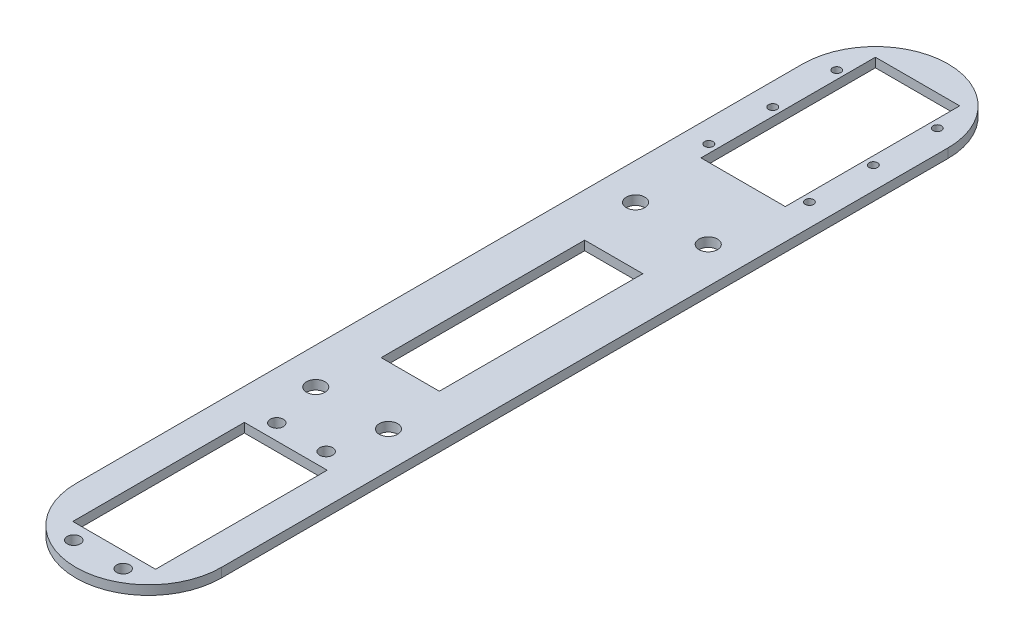
ISO-10303-21;
HEADER;
FILE_DESCRIPTION(('STEP AP214'),'2;1');
FILE_NAME('part.step','',(''),(''),'','','');
FILE_SCHEMA(('AUTOMOTIVE_DESIGN { 1 0 10303 214 1 1 1 1 }'));
ENDSEC;
DATA;
#1=APPLICATION_CONTEXT('core data for automotive mechanical design processes');
#2=APPLICATION_PROTOCOL_DEFINITION('international standard','automotive_design',2000,#1);
#3=PRODUCT_CONTEXT('',#1,'mechanical');
#4=PRODUCT('Part','Part','',(#3));
#5=PRODUCT_RELATED_PRODUCT_CATEGORY('part','',(#4));
#6=PRODUCT_DEFINITION_FORMATION('','',#4);
#7=PRODUCT_DEFINITION_CONTEXT('part definition',#1,'design');
#8=PRODUCT_DEFINITION('design','',#6,#7);
#9=PRODUCT_DEFINITION_SHAPE('','',#8);
#10=(LENGTH_UNIT() NAMED_UNIT(*) SI_UNIT(.MILLI.,.METRE.));
#11=(NAMED_UNIT(*) PLANE_ANGLE_UNIT() SI_UNIT($,.RADIAN.));
#12=(NAMED_UNIT(*) SI_UNIT($,.STERADIAN.) SOLID_ANGLE_UNIT());
#13=UNCERTAINTY_MEASURE_WITH_UNIT(LENGTH_MEASURE(1.E-05),#10,'distance_accuracy_value','');
#14=(GEOMETRIC_REPRESENTATION_CONTEXT(3) GLOBAL_UNCERTAINTY_ASSIGNED_CONTEXT((#13)) GLOBAL_UNIT_ASSIGNED_CONTEXT((#10,
#11,#12)) REPRESENTATION_CONTEXT('',''));
#15=CARTESIAN_POINT('',(0.,0.,0.));
#16=DIRECTION('',(0.,0.,1.));
#17=DIRECTION('',(1.,0.,0.));
#18=AXIS2_PLACEMENT_3D('',#15,#16,#17);
#19=CARTESIAN_POINT('',(0.,3.175,0.));
#20=DIRECTION('',(0.,1.,0.));
#21=DIRECTION('',(0.,0.,1.));
#22=AXIS2_PLACEMENT_3D('',#19,#20,#21);
#23=PLANE('',#22);
#24=CARTESIAN_POINT('',(7.69999999999999,3.175,65.));
#25=DIRECTION('',(0.,-1.,0.));
#26=DIRECTION('',(0.,0.,-1.));
#27=AXIS2_PLACEMENT_3D('',#24,#25,#26);
#28=CIRCLE('',#27,1.45);
#29=CARTESIAN_POINT('',(7.69999999999999,3.175,63.55));
#30=VERTEX_POINT('',#29);
#31=EDGE_CURVE('E548',#30,#30,#28,.T.);
#32=ORIENTED_EDGE('',*,*,#31,.T.);
#33=EDGE_LOOP('',(#32));
#34=FACE_BOUND('',#33,.T.);
#35=CARTESIAN_POINT('',(42.3,3.175,65.));
#36=DIRECTION('',(0.,-1.,0.));
#37=DIRECTION('',(0.,0.,-1.));
#38=AXIS2_PLACEMENT_3D('',#35,#36,#37);
#39=CIRCLE('',#38,1.45);
#40=CARTESIAN_POINT('',(42.3,3.175,63.55));
#41=VERTEX_POINT('',#40);
#42=EDGE_CURVE('E557',#41,#41,#39,.T.);
#43=ORIENTED_EDGE('',*,*,#42,.T.);
#44=EDGE_LOOP('',(#43));
#45=FACE_BOUND('',#44,.T.);
#46=CARTESIAN_POINT('',(7.69999999999999,3.175,43.));
#47=DIRECTION('',(0.,-1.,0.));
#48=DIRECTION('',(0.,0.,-1.));
#49=AXIS2_PLACEMENT_3D('',#46,#47,#48);
#50=CIRCLE('',#49,1.45);
#51=CARTESIAN_POINT('',(7.69999999999999,3.175,41.55));
#52=VERTEX_POINT('',#51);
#53=EDGE_CURVE('E405',#52,#52,#50,.T.);
#54=ORIENTED_EDGE('',*,*,#53,.T.);
#55=EDGE_LOOP('',(#54));
#56=FACE_BOUND('',#55,.T.);
#57=CARTESIAN_POINT('',(25.,3.175,275.));
#58=DIRECTION('',(0.,1.,0.));
#59=DIRECTION('',(0.,0.,1.));
#60=AXIS2_PLACEMENT_3D('',#57,#58,#59);
#61=CIRCLE('',#60,25.);
#62=CARTESIAN_POINT('',(0.,3.175,275.));
#63=VERTEX_POINT('',#62);
#64=CARTESIAN_POINT('',(50.,3.175,275.));
#65=VERTEX_POINT('',#64);
#66=EDGE_CURVE('E217',#63,#65,#61,.T.);
#67=ORIENTED_EDGE('',*,*,#66,.T.);
#68=DIRECTION('',(0.,0.,-1.));
#69=VECTOR('',#68,1.);
#70=CARTESIAN_POINT('',(50.,3.175,0.));
#71=LINE('',#70,#69);
#72=CARTESIAN_POINT('',(50.,3.175,25.));
#73=VERTEX_POINT('',#72);
#74=EDGE_CURVE('E292',#65,#73,#71,.T.);
#75=ORIENTED_EDGE('',*,*,#74,.T.);
#76=CARTESIAN_POINT('',(25.,3.175,25.));
#77=DIRECTION('',(0.,1.,0.));
#78=DIRECTION('',(0.,0.,1.));
#79=AXIS2_PLACEMENT_3D('',#76,#77,#78);
#80=CIRCLE('',#79,25.);
#81=CARTESIAN_POINT('',(0.,3.175,25.));
#82=VERTEX_POINT('',#81);
#83=EDGE_CURVE('E227',#73,#82,#80,.T.);
#84=ORIENTED_EDGE('',*,*,#83,.T.);
#85=DIRECTION('',(0.,0.,1.));
#86=VECTOR('',#85,1.);
#87=CARTESIAN_POINT('',(0.,3.175,0.));
#88=LINE('',#87,#86);
#89=EDGE_CURVE('E289',#82,#63,#88,.T.);
#90=ORIENTED_EDGE('',*,*,#89,.T.);
#91=EDGE_LOOP('',(#67,#75,#84,#90));
#92=FACE_BOUND('',#91,.T.);
#93=DIRECTION('',(0.,0.,1.));
#94=VECTOR('',#93,1.);
#95=CARTESIAN_POINT('',(10.5,3.175,10.5));
#96=LINE('',#95,#94);
#97=CARTESIAN_POINT('',(10.5,3.175,10.5));
#98=VERTEX_POINT('',#97);
#99=CARTESIAN_POINT('',(10.5,3.175,70.5));
#100=VERTEX_POINT('',#99);
#101=EDGE_CURVE('E262',#98,#100,#96,.T.);
#102=ORIENTED_EDGE('',*,*,#101,.F.);
#103=DIRECTION('',(-1.,0.,0.));
#104=VECTOR('',#103,1.);
#105=CARTESIAN_POINT('',(10.5,3.175,10.5));
#106=LINE('',#105,#104);
#107=CARTESIAN_POINT('',(39.5,3.175,10.5));
#108=VERTEX_POINT('',#107);
#109=EDGE_CURVE('E276',#108,#98,#106,.T.);
#110=ORIENTED_EDGE('',*,*,#109,.F.);
#111=DIRECTION('',(0.,0.,-1.));
#112=VECTOR('',#111,1.);
#113=CARTESIAN_POINT('',(39.5,3.175,10.5));
#114=LINE('',#113,#112);
#115=CARTESIAN_POINT('',(39.5,3.175,70.5));
#116=VERTEX_POINT('',#115);
#117=EDGE_CURVE('E273',#116,#108,#114,.T.);
#118=ORIENTED_EDGE('',*,*,#117,.F.);
#119=DIRECTION('',(1.,0.,0.));
#120=VECTOR('',#119,1.);
#121=CARTESIAN_POINT('',(10.5,3.175,70.5));
#122=LINE('',#121,#120);
#123=EDGE_CURVE('E270',#100,#116,#122,.T.);
#124=ORIENTED_EDGE('',*,*,#123,.F.);
#125=EDGE_LOOP('',(#102,#110,#118,#124));
#126=FACE_BOUND('',#125,.T.);
#127=DIRECTION('',(0.,0.,1.));
#128=VECTOR('',#127,1.);
#129=CARTESIAN_POINT('',(10.76,3.175,227.81));
#130=LINE('',#129,#128);
#131=CARTESIAN_POINT('',(10.76,3.175,227.81));
#132=VERTEX_POINT('',#131);
#133=CARTESIAN_POINT('',(10.76,3.175,286.84));
#134=VERTEX_POINT('',#133);
#135=EDGE_CURVE('E248',#132,#134,#130,.T.);
#136=ORIENTED_EDGE('',*,*,#135,.F.);
#137=DIRECTION('',(-1.,0.,0.));
#138=VECTOR('',#137,1.);
#139=CARTESIAN_POINT('',(10.76,3.175,227.81));
#140=LINE('',#139,#138);
#141=CARTESIAN_POINT('',(39.24,3.175,227.81));
#142=VERTEX_POINT('',#141);
#143=EDGE_CURVE('E256',#142,#132,#140,.T.);
#144=ORIENTED_EDGE('',*,*,#143,.F.);
#145=DIRECTION('',(0.,0.,-1.));
#146=VECTOR('',#145,1.);
#147=CARTESIAN_POINT('',(39.24,3.175,227.81));
#148=LINE('',#147,#146);
#149=CARTESIAN_POINT('',(39.24,3.175,286.84));
#150=VERTEX_POINT('',#149);
#151=EDGE_CURVE('E253',#150,#142,#148,.T.);
#152=ORIENTED_EDGE('',*,*,#151,.F.);
#153=DIRECTION('',(1.,0.,0.));
#154=VECTOR('',#153,1.);
#155=CARTESIAN_POINT('',(10.76,3.175,286.84));
#156=LINE('',#155,#154);
#157=EDGE_CURVE('E250',#134,#150,#156,.T.);
#158=ORIENTED_EDGE('',*,*,#157,.F.);
#159=EDGE_LOOP('',(#136,#144,#152,#158));
#160=FACE_BOUND('',#159,.T.);
#161=CARTESIAN_POINT('',(16.5,3.175,292.24));
#162=DIRECTION('',(0.,1.,0.));
#163=DIRECTION('',(0.,0.,1.));
#164=AXIS2_PLACEMENT_3D('',#161,#162,#163);
#165=CIRCLE('',#164,2.25);
#166=CARTESIAN_POINT('',(16.5,3.175,294.49));
#167=VERTEX_POINT('',#166);
#168=EDGE_CURVE('E244',#167,#167,#165,.T.);
#169=ORIENTED_EDGE('',*,*,#168,.F.);
#170=EDGE_LOOP('',(#169));
#171=FACE_BOUND('',#170,.T.);
#172=CARTESIAN_POINT('',(33.5,3.175,292.24));
#173=DIRECTION('',(0.,1.,0.));
#174=DIRECTION('',(0.,0.,-1.));
#175=AXIS2_PLACEMENT_3D('',#172,#173,#174);
#176=CIRCLE('',#175,2.25);
#177=CARTESIAN_POINT('',(33.5,3.175,289.99));
#178=VERTEX_POINT('',#177);
#179=EDGE_CURVE('E240',#178,#178,#176,.T.);
#180=ORIENTED_EDGE('',*,*,#179,.F.);
#181=EDGE_LOOP('',(#180));
#182=FACE_BOUND('',#181,.T.);
#183=CARTESIAN_POINT('',(16.5,3.175,222.41));
#184=DIRECTION('',(0.,1.,0.));
#185=DIRECTION('',(0.,0.,-1.));
#186=AXIS2_PLACEMENT_3D('',#183,#184,#185);
#187=CIRCLE('',#186,2.25);
#188=CARTESIAN_POINT('',(16.5,3.175,220.16));
#189=VERTEX_POINT('',#188);
#190=EDGE_CURVE('E236',#189,#189,#187,.T.);
#191=ORIENTED_EDGE('',*,*,#190,.F.);
#192=EDGE_LOOP('',(#191));
#193=FACE_BOUND('',#192,.T.);
#194=CARTESIAN_POINT('',(33.5,3.175,222.41));
#195=DIRECTION('',(0.,1.,0.));
#196=DIRECTION('',(0.,0.,1.));
#197=AXIS2_PLACEMENT_3D('',#194,#195,#196);
#198=CIRCLE('',#197,2.25000000000001);
#199=CARTESIAN_POINT('',(33.5,3.175,224.66));
#200=VERTEX_POINT('',#199);
#201=EDGE_CURVE('E232',#200,#200,#198,.T.);
#202=ORIENTED_EDGE('',*,*,#201,.F.);
#203=EDGE_LOOP('',(#202));
#204=FACE_BOUND('',#203,.T.);
#205=DIRECTION('',(0.,0.,1.));
#206=VECTOR('',#205,1.);
#207=CARTESIAN_POINT('',(15.0000000000003,3.175,0.));
#208=LINE('',#207,#206);
#209=CARTESIAN_POINT('',(15.0000000000001,3.175,115.));
#210=VERTEX_POINT('',#209);
#211=CARTESIAN_POINT('',(15.,3.175,185.));
#212=VERTEX_POINT('',#211);
#213=EDGE_CURVE('E215',#210,#212,#208,.T.);
#214=ORIENTED_EDGE('',*,*,#213,.F.);
#215=DIRECTION('',(-1.,0.,0.));
#216=VECTOR('',#215,1.);
#217=CARTESIAN_POINT('',(0.,3.175,115.));
#218=LINE('',#217,#216);
#219=CARTESIAN_POINT('',(35.,3.175,115.));
#220=VERTEX_POINT('',#219);
#221=EDGE_CURVE('E208',#220,#210,#218,.T.);
#222=ORIENTED_EDGE('',*,*,#221,.F.);
#223=DIRECTION('',(0.,0.,-1.));
#224=VECTOR('',#223,1.);
#225=CARTESIAN_POINT('',(35.,3.175,0.));
#226=LINE('',#225,#224);
#227=CARTESIAN_POINT('',(35.,3.175,185.));
#228=VERTEX_POINT('',#227);
#229=EDGE_CURVE('E188',#228,#220,#226,.T.);
#230=ORIENTED_EDGE('',*,*,#229,.F.);
#231=DIRECTION('',(1.,0.,0.));
#232=VECTOR('',#231,1.);
#233=CARTESIAN_POINT('',(0.,3.175,185.));
#234=LINE('',#233,#232);
#235=EDGE_CURVE('E213',#212,#228,#234,.T.);
#236=ORIENTED_EDGE('',*,*,#235,.F.);
#237=EDGE_LOOP('',(#214,#222,#230,#236));
#238=FACE_BOUND('',#237,.T.);
#239=CARTESIAN_POINT('',(12.5,3.175,205.));
#240=DIRECTION('',(0.,1.,0.));
#241=DIRECTION('',(0.,0.,1.));
#242=AXIS2_PLACEMENT_3D('',#239,#240,#241);
#243=CIRCLE('',#242,3.175);
#244=CARTESIAN_POINT('',(12.5,3.175,208.175));
#245=VERTEX_POINT('',#244);
#246=EDGE_CURVE('E374',#245,#245,#243,.T.);
#247=ORIENTED_EDGE('',*,*,#246,.F.);
#248=EDGE_LOOP('',(#247));
#249=FACE_BOUND('',#248,.T.);
#250=CARTESIAN_POINT('',(12.5,3.175,95.));
#251=DIRECTION('',(0.,1.,0.));
#252=DIRECTION('',(0.,0.,1.));
#253=AXIS2_PLACEMENT_3D('',#250,#251,#252);
#254=CIRCLE('',#253,3.175);
#255=CARTESIAN_POINT('',(12.5,3.175,98.175));
#256=VERTEX_POINT('',#255);
#257=EDGE_CURVE('E378',#256,#256,#254,.T.);
#258=ORIENTED_EDGE('',*,*,#257,.F.);
#259=EDGE_LOOP('',(#258));
#260=FACE_BOUND('',#259,.T.);
#261=CARTESIAN_POINT('',(37.5,3.175,95.));
#262=DIRECTION('',(0.,1.,0.));
#263=DIRECTION('',(0.,0.,1.));
#264=AXIS2_PLACEMENT_3D('',#261,#262,#263);
#265=CIRCLE('',#264,3.175);
#266=CARTESIAN_POINT('',(37.5,3.175,98.175));
#267=VERTEX_POINT('',#266);
#268=EDGE_CURVE('E382',#267,#267,#265,.T.);
#269=ORIENTED_EDGE('',*,*,#268,.F.);
#270=EDGE_LOOP('',(#269));
#271=FACE_BOUND('',#270,.T.);
#272=CARTESIAN_POINT('',(37.5,3.175,205.));
#273=DIRECTION('',(0.,1.,0.));
#274=DIRECTION('',(0.,0.,1.));
#275=AXIS2_PLACEMENT_3D('',#272,#273,#274);
#276=CIRCLE('',#275,3.175);
#277=CARTESIAN_POINT('',(37.5,3.175,208.175));
#278=VERTEX_POINT('',#277);
#279=EDGE_CURVE('E386',#278,#278,#276,.T.);
#280=ORIENTED_EDGE('',*,*,#279,.F.);
#281=EDGE_LOOP('',(#280));
#282=FACE_BOUND('',#281,.T.);
#283=CARTESIAN_POINT('',(7.69999999999999,3.175,21.));
#284=DIRECTION('',(0.,-1.,0.));
#285=DIRECTION('',(0.,0.,-1.));
#286=AXIS2_PLACEMENT_3D('',#283,#284,#285);
#287=CIRCLE('',#286,1.45);
#288=CARTESIAN_POINT('',(7.69999999999999,3.175,19.55));
#289=VERTEX_POINT('',#288);
#290=EDGE_CURVE('E390',#289,#289,#287,.T.);
#291=ORIENTED_EDGE('',*,*,#290,.T.);
#292=EDGE_LOOP('',(#291));
#293=FACE_BOUND('',#292,.T.);
#294=CARTESIAN_POINT('',(42.3,3.175,21.));
#295=DIRECTION('',(0.,-1.,0.));
#296=DIRECTION('',(0.,0.,-1.));
#297=AXIS2_PLACEMENT_3D('',#294,#295,#296);
#298=CIRCLE('',#297,1.45);
#299=CARTESIAN_POINT('',(42.3,3.175,19.55));
#300=VERTEX_POINT('',#299);
#301=EDGE_CURVE('E394',#300,#300,#298,.T.);
#302=ORIENTED_EDGE('',*,*,#301,.T.);
#303=EDGE_LOOP('',(#302));
#304=FACE_BOUND('',#303,.T.);
#305=CARTESIAN_POINT('',(42.3,3.175,43.));
#306=DIRECTION('',(0.,-1.,0.));
#307=DIRECTION('',(0.,0.,-1.));
#308=AXIS2_PLACEMENT_3D('',#305,#306,#307);
#309=CIRCLE('',#308,1.45);
#310=CARTESIAN_POINT('',(42.3,3.175,41.55));
#311=VERTEX_POINT('',#310);
#312=EDGE_CURVE('E397',#311,#311,#309,.T.);
#313=ORIENTED_EDGE('',*,*,#312,.T.);
#314=EDGE_LOOP('',(#313));
#315=FACE_BOUND('',#314,.T.);
#316=ADVANCED_FACE('F69',(#34,#45,#56,#92,#126,#160,#171,#182,#193,#204,#238,#249,#260,#271,
#282,#293,#304,#315),#23,.T.);
#317=CARTESIAN_POINT('',(0.,0.,0.));
#318=DIRECTION('',(0.,1.,0.));
#319=DIRECTION('',(0.,0.,1.));
#320=AXIS2_PLACEMENT_3D('',#317,#318,#319);
#321=PLANE('',#320);
#322=CARTESIAN_POINT('',(7.69999999999999,0.,65.));
#323=DIRECTION('',(0.,-1.,0.));
#324=DIRECTION('',(0.,0.,-1.));
#325=AXIS2_PLACEMENT_3D('',#322,#323,#324);
#326=CIRCLE('',#325,1.44999999999999);
#327=CARTESIAN_POINT('',(7.69999999999999,0.,63.55));
#328=VERTEX_POINT('',#327);
#329=EDGE_CURVE('E550',#328,#328,#326,.T.);
#330=ORIENTED_EDGE('',*,*,#329,.F.);
#331=EDGE_LOOP('',(#330));
#332=FACE_BOUND('',#331,.T.);
#333=CARTESIAN_POINT('',(42.3,0.,65.));
#334=DIRECTION('',(0.,-1.,0.));
#335=DIRECTION('',(0.,0.,-1.));
#336=AXIS2_PLACEMENT_3D('',#333,#334,#335);
#337=CIRCLE('',#336,1.44999999999999);
#338=CARTESIAN_POINT('',(42.3,0.,63.55));
#339=VERTEX_POINT('',#338);
#340=EDGE_CURVE('E552',#339,#339,#337,.T.);
#341=ORIENTED_EDGE('',*,*,#340,.F.);
#342=EDGE_LOOP('',(#341));
#343=FACE_BOUND('',#342,.T.);
#344=CARTESIAN_POINT('',(7.69999999999999,0.,43.));
#345=DIRECTION('',(0.,-1.,0.));
#346=DIRECTION('',(0.,0.,-1.));
#347=AXIS2_PLACEMENT_3D('',#344,#345,#346);
#348=CIRCLE('',#347,1.44999999999999);
#349=CARTESIAN_POINT('',(7.69999999999999,0.,41.55));
#350=VERTEX_POINT('',#349);
#351=EDGE_CURVE('E560',#350,#350,#348,.T.);
#352=ORIENTED_EDGE('',*,*,#351,.F.);
#353=EDGE_LOOP('',(#352));
#354=FACE_BOUND('',#353,.T.);
#355=CARTESIAN_POINT('',(42.3,0.,43.));
#356=DIRECTION('',(0.,-1.,0.));
#357=DIRECTION('',(0.,0.,-1.));
#358=AXIS2_PLACEMENT_3D('',#355,#356,#357);
#359=CIRCLE('',#358,1.44999999999999);
#360=CARTESIAN_POINT('',(42.3,0.,41.55));
#361=VERTEX_POINT('',#360);
#362=EDGE_CURVE('E400',#361,#361,#359,.T.);
#363=ORIENTED_EDGE('',*,*,#362,.F.);
#364=EDGE_LOOP('',(#363));
#365=FACE_BOUND('',#364,.T.);
#366=CARTESIAN_POINT('',(42.3,0.,21.));
#367=DIRECTION('',(0.,-1.,0.));
#368=DIRECTION('',(0.,0.,-1.));
#369=AXIS2_PLACEMENT_3D('',#366,#367,#368);
#370=CIRCLE('',#369,1.44999999999999);
#371=CARTESIAN_POINT('',(42.3,0.,19.55));
#372=VERTEX_POINT('',#371);
#373=EDGE_CURVE('E399',#372,#372,#370,.T.);
#374=ORIENTED_EDGE('',*,*,#373,.F.);
#375=EDGE_LOOP('',(#374));
#376=FACE_BOUND('',#375,.T.);
#377=CARTESIAN_POINT('',(7.69999999999999,0.,21.));
#378=DIRECTION('',(0.,-1.,0.));
#379=DIRECTION('',(0.,0.,-1.));
#380=AXIS2_PLACEMENT_3D('',#377,#378,#379);
#381=CIRCLE('',#380,1.44999999999999);
#382=CARTESIAN_POINT('',(7.69999999999999,0.,19.55));
#383=VERTEX_POINT('',#382);
#384=EDGE_CURVE('E410',#383,#383,#381,.T.);
#385=ORIENTED_EDGE('',*,*,#384,.F.);
#386=EDGE_LOOP('',(#385));
#387=FACE_BOUND('',#386,.T.);
#388=CARTESIAN_POINT('',(37.5,0.,205.));
#389=DIRECTION('',(0.,-1.,0.));
#390=DIRECTION('',(0.,0.,1.));
#391=AXIS2_PLACEMENT_3D('',#388,#389,#390);
#392=CIRCLE('',#391,3.175);
#393=CARTESIAN_POINT('',(37.5,0.,208.175));
#394=VERTEX_POINT('',#393);
#395=EDGE_CURVE('E414',#394,#394,#392,.T.);
#396=ORIENTED_EDGE('',*,*,#395,.F.);
#397=EDGE_LOOP('',(#396));
#398=FACE_BOUND('',#397,.T.);
#399=CARTESIAN_POINT('',(37.5,0.,95.));
#400=DIRECTION('',(0.,-1.,0.));
#401=DIRECTION('',(0.,0.,-1.));
#402=AXIS2_PLACEMENT_3D('',#399,#400,#401);
#403=CIRCLE('',#402,3.175);
#404=CARTESIAN_POINT('',(37.5,0.,91.825));
#405=VERTEX_POINT('',#404);
#406=EDGE_CURVE('E418',#405,#405,#403,.T.);
#407=ORIENTED_EDGE('',*,*,#406,.F.);
#408=EDGE_LOOP('',(#407));
#409=FACE_BOUND('',#408,.T.);
#410=CARTESIAN_POINT('',(12.5,0.,95.));
#411=DIRECTION('',(0.,-1.,0.));
#412=DIRECTION('',(0.,0.,1.));
#413=AXIS2_PLACEMENT_3D('',#410,#411,#412);
#414=CIRCLE('',#413,3.175);
#415=CARTESIAN_POINT('',(12.5,0.,98.175));
#416=VERTEX_POINT('',#415);
#417=EDGE_CURVE('E422',#416,#416,#414,.T.);
#418=ORIENTED_EDGE('',*,*,#417,.F.);
#419=EDGE_LOOP('',(#418));
#420=FACE_BOUND('',#419,.T.);
#421=CARTESIAN_POINT('',(12.5,0.,205.));
#422=DIRECTION('',(0.,-1.,0.));
#423=DIRECTION('',(0.,0.,-1.));
#424=AXIS2_PLACEMENT_3D('',#421,#422,#423);
#425=CIRCLE('',#424,3.175);
#426=CARTESIAN_POINT('',(12.5,0.,201.825));
#427=VERTEX_POINT('',#426);
#428=EDGE_CURVE('E426',#427,#427,#425,.T.);
#429=ORIENTED_EDGE('',*,*,#428,.F.);
#430=EDGE_LOOP('',(#429));
#431=FACE_BOUND('',#430,.T.);
#432=DIRECTION('',(1.,0.,0.));
#433=VECTOR('',#432,1.);
#434=CARTESIAN_POINT('',(15.0000000000001,0.,115.));
#435=LINE('',#434,#433);
#436=CARTESIAN_POINT('',(15.0000000000001,0.,115.));
#437=VERTEX_POINT('',#436);
#438=CARTESIAN_POINT('',(35.,0.,115.));
#439=VERTEX_POINT('',#438);
#440=EDGE_CURVE('E194',#437,#439,#435,.T.);
#441=ORIENTED_EDGE('',*,*,#440,.F.);
#442=DIRECTION('',(0.,0.,-1.));
#443=VECTOR('',#442,1.);
#444=CARTESIAN_POINT('',(15.,0.,185.));
#445=LINE('',#444,#443);
#446=CARTESIAN_POINT('',(15.,0.,185.));
#447=VERTEX_POINT('',#446);
#448=EDGE_CURVE('E92',#447,#437,#445,.T.);
#449=ORIENTED_EDGE('',*,*,#448,.F.);
#450=DIRECTION('',(-1.,0.,0.));
#451=VECTOR('',#450,1.);
#452=CARTESIAN_POINT('',(15.,0.,185.));
#453=LINE('',#452,#451);
#454=CARTESIAN_POINT('',(35.,0.,185.));
#455=VERTEX_POINT('',#454);
#456=EDGE_CURVE('E201',#455,#447,#453,.T.);
#457=ORIENTED_EDGE('',*,*,#456,.F.);
#458=DIRECTION('',(0.,0.,1.));
#459=VECTOR('',#458,1.);
#460=CARTESIAN_POINT('',(35.,0.,185.));
#461=LINE('',#460,#459);
#462=EDGE_CURVE('E185',#439,#455,#461,.T.);
#463=ORIENTED_EDGE('',*,*,#462,.F.);
#464=EDGE_LOOP('',(#441,#449,#457,#463));
#465=FACE_BOUND('',#464,.T.);
#466=CARTESIAN_POINT('',(33.5,0.,222.41));
#467=DIRECTION('',(0.,1.,0.));
#468=DIRECTION('',(0.,0.,1.));
#469=AXIS2_PLACEMENT_3D('',#466,#467,#468);
#470=CIRCLE('',#469,2.25000000000001);
#471=CARTESIAN_POINT('',(33.5,0.,224.66));
#472=VERTEX_POINT('',#471);
#473=EDGE_CURVE('E235',#472,#472,#470,.T.);
#474=ORIENTED_EDGE('',*,*,#473,.T.);
#475=EDGE_LOOP('',(#474));
#476=FACE_BOUND('',#475,.T.);
#477=CARTESIAN_POINT('',(16.5,0.,222.41));
#478=DIRECTION('',(0.,1.,0.));
#479=DIRECTION('',(0.,0.,1.));
#480=AXIS2_PLACEMENT_3D('',#477,#478,#479);
#481=CIRCLE('',#480,2.25);
#482=CARTESIAN_POINT('',(16.5,0.,224.66));
#483=VERTEX_POINT('',#482);
#484=EDGE_CURVE('E239',#483,#483,#481,.T.);
#485=ORIENTED_EDGE('',*,*,#484,.T.);
#486=EDGE_LOOP('',(#485));
#487=FACE_BOUND('',#486,.T.);
#488=CARTESIAN_POINT('',(33.5,0.,292.24));
#489=DIRECTION('',(0.,1.,0.));
#490=DIRECTION('',(0.,0.,1.));
#491=AXIS2_PLACEMENT_3D('',#488,#489,#490);
#492=CIRCLE('',#491,2.25);
#493=CARTESIAN_POINT('',(33.5,0.,294.49));
#494=VERTEX_POINT('',#493);
#495=EDGE_CURVE('E243',#494,#494,#492,.T.);
#496=ORIENTED_EDGE('',*,*,#495,.T.);
#497=EDGE_LOOP('',(#496));
#498=FACE_BOUND('',#497,.T.);
#499=CARTESIAN_POINT('',(16.5,0.,292.24));
#500=DIRECTION('',(0.,1.,0.));
#501=DIRECTION('',(0.,0.,1.));
#502=AXIS2_PLACEMENT_3D('',#499,#500,#501);
#503=CIRCLE('',#502,2.25);
#504=CARTESIAN_POINT('',(16.5,0.,294.49));
#505=VERTEX_POINT('',#504);
#506=EDGE_CURVE('E247',#505,#505,#503,.T.);
#507=ORIENTED_EDGE('',*,*,#506,.T.);
#508=EDGE_LOOP('',(#507));
#509=FACE_BOUND('',#508,.T.);
#510=DIRECTION('',(-1.,0.,0.));
#511=VECTOR('',#510,1.);
#512=CARTESIAN_POINT('',(0.,0.,227.81));
#513=LINE('',#512,#511);
#514=CARTESIAN_POINT('',(39.24,0.,227.81));
#515=VERTEX_POINT('',#514);
#516=CARTESIAN_POINT('',(10.76,0.,227.81));
#517=VERTEX_POINT('',#516);
#518=EDGE_CURVE('E316',#515,#517,#513,.T.);
#519=ORIENTED_EDGE('',*,*,#518,.T.);
#520=DIRECTION('',(0.,0.,1.));
#521=VECTOR('',#520,1.);
#522=CARTESIAN_POINT('',(10.76,0.,0.));
#523=LINE('',#522,#521);
#524=CARTESIAN_POINT('',(10.76,0.,286.84));
#525=VERTEX_POINT('',#524);
#526=EDGE_CURVE('E319',#517,#525,#523,.T.);
#527=ORIENTED_EDGE('',*,*,#526,.T.);
#528=DIRECTION('',(1.,0.,0.));
#529=VECTOR('',#528,1.);
#530=CARTESIAN_POINT('',(0.,0.,286.84));
#531=LINE('',#530,#529);
#532=CARTESIAN_POINT('',(39.24,0.,286.84));
#533=VERTEX_POINT('',#532);
#534=EDGE_CURVE('E310',#525,#533,#531,.T.);
#535=ORIENTED_EDGE('',*,*,#534,.T.);
#536=DIRECTION('',(0.,0.,-1.));
#537=VECTOR('',#536,1.);
#538=CARTESIAN_POINT('',(39.24,0.,0.));
#539=LINE('',#538,#537);
#540=EDGE_CURVE('E313',#533,#515,#539,.T.);
#541=ORIENTED_EDGE('',*,*,#540,.T.);
#542=EDGE_LOOP('',(#519,#527,#535,#541));
#543=FACE_BOUND('',#542,.T.);
#544=DIRECTION('',(-1.,0.,0.));
#545=VECTOR('',#544,1.);
#546=CARTESIAN_POINT('',(0.,0.,10.5));
#547=LINE('',#546,#545);
#548=CARTESIAN_POINT('',(39.5,0.,10.5));
#549=VERTEX_POINT('',#548);
#550=CARTESIAN_POINT('',(10.5,0.,10.5));
#551=VERTEX_POINT('',#550);
#552=EDGE_CURVE('E304',#549,#551,#547,.T.);
#553=ORIENTED_EDGE('',*,*,#552,.T.);
#554=DIRECTION('',(0.,0.,1.));
#555=VECTOR('',#554,1.);
#556=CARTESIAN_POINT('',(10.5,0.,0.));
#557=LINE('',#556,#555);
#558=CARTESIAN_POINT('',(10.5,0.,70.5));
#559=VERTEX_POINT('',#558);
#560=EDGE_CURVE('E307',#551,#559,#557,.T.);
#561=ORIENTED_EDGE('',*,*,#560,.T.);
#562=DIRECTION('',(1.,0.,0.));
#563=VECTOR('',#562,1.);
#564=CARTESIAN_POINT('',(0.,0.,70.5));
#565=LINE('',#564,#563);
#566=CARTESIAN_POINT('',(39.5,0.,70.5));
#567=VERTEX_POINT('',#566);
#568=EDGE_CURVE('E295',#559,#567,#565,.T.);
#569=ORIENTED_EDGE('',*,*,#568,.T.);
#570=DIRECTION('',(0.,0.,-1.));
#571=VECTOR('',#570,1.);
#572=CARTESIAN_POINT('',(39.5,0.,0.));
#573=LINE('',#572,#571);
#574=EDGE_CURVE('E301',#567,#549,#573,.T.);
#575=ORIENTED_EDGE('',*,*,#574,.T.);
#576=EDGE_LOOP('',(#553,#561,#569,#575));
#577=FACE_BOUND('',#576,.T.);
#578=DIRECTION('',(0.,0.,-1.));
#579=VECTOR('',#578,1.);
#580=CARTESIAN_POINT('',(50.,0.,0.));
#581=LINE('',#580,#579);
#582=CARTESIAN_POINT('',(50.,0.,275.));
#583=VERTEX_POINT('',#582);
#584=CARTESIAN_POINT('',(50.,0.,25.));
#585=VERTEX_POINT('',#584);
#586=EDGE_CURVE('E293',#583,#585,#581,.T.);
#587=ORIENTED_EDGE('',*,*,#586,.F.);
#588=CARTESIAN_POINT('',(25.,0.,275.));
#589=DIRECTION('',(0.,1.,0.));
#590=DIRECTION('',(0.,0.,1.));
#591=AXIS2_PLACEMENT_3D('',#588,#589,#590);
#592=CIRCLE('',#591,25.);
#593=CARTESIAN_POINT('',(0.,0.,275.));
#594=VERTEX_POINT('',#593);
#595=EDGE_CURVE('E222',#594,#583,#592,.T.);
#596=ORIENTED_EDGE('',*,*,#595,.F.);
#597=DIRECTION('',(0.,0.,1.));
#598=VECTOR('',#597,1.);
#599=CARTESIAN_POINT('',(0.,0.,0.));
#600=LINE('',#599,#598);
#601=CARTESIAN_POINT('',(0.,0.,25.));
#602=VERTEX_POINT('',#601);
#603=EDGE_CURVE('E282',#602,#594,#600,.T.);
#604=ORIENTED_EDGE('',*,*,#603,.F.);
#605=CARTESIAN_POINT('',(25.,0.,25.));
#606=DIRECTION('',(0.,1.,0.));
#607=DIRECTION('',(0.,0.,1.));
#608=AXIS2_PLACEMENT_3D('',#605,#606,#607);
#609=CIRCLE('',#608,25.);
#610=EDGE_CURVE('E77',#585,#602,#609,.T.);
#611=ORIENTED_EDGE('',*,*,#610,.F.);
#612=EDGE_LOOP('',(#587,#596,#604,#611));
#613=FACE_BOUND('',#612,.T.);
#614=ADVANCED_FACE('F198',(#332,#343,#354,#365,#376,#387,#398,#409,#420,#431,#465,#476,#487,
#498,#509,#543,#577,#613),#321,.F.);
#615=CARTESIAN_POINT('',(50.,3.175,0.));
#616=DIRECTION('',(-1.,0.,0.));
#617=DIRECTION('',(0.,0.,1.));
#618=AXIS2_PLACEMENT_3D('',#615,#616,#617);
#619=PLANE('',#618);
#620=DIRECTION('',(0.,1.,0.));
#621=VECTOR('',#620,1.);
#622=CARTESIAN_POINT('',(50.,-3.175,275.));
#623=LINE('',#622,#621);
#624=EDGE_CURVE('E12',#583,#65,#623,.T.);
#625=ORIENTED_EDGE('',*,*,#624,.F.);
#626=ORIENTED_EDGE('',*,*,#586,.T.);
#627=DIRECTION('',(0.,1.,0.));
#628=VECTOR('',#627,1.);
#629=CARTESIAN_POINT('',(50.,-3.175,25.));
#630=LINE('',#629,#628);
#631=EDGE_CURVE('E224',#585,#73,#630,.T.);
#632=ORIENTED_EDGE('',*,*,#631,.T.);
#633=ORIENTED_EDGE('',*,*,#74,.F.);
#634=EDGE_LOOP('',(#625,#626,#632,#633));
#635=FACE_BOUND('',#634,.T.);
#636=ADVANCED_FACE('F346',(#635),#619,.F.);
#637=CARTESIAN_POINT('',(0.,3.175,0.));
#638=DIRECTION('',(1.,0.,0.));
#639=DIRECTION('',(0.,0.,-1.));
#640=AXIS2_PLACEMENT_3D('',#637,#638,#639);
#641=PLANE('',#640);
#642=ORIENTED_EDGE('',*,*,#603,.T.);
#643=DIRECTION('',(0.,1.,0.));
#644=VECTOR('',#643,1.);
#645=CARTESIAN_POINT('',(0.,-3.175,275.));
#646=LINE('',#645,#644);
#647=EDGE_CURVE('E219',#594,#63,#646,.T.);
#648=ORIENTED_EDGE('',*,*,#647,.T.);
#649=ORIENTED_EDGE('',*,*,#89,.F.);
#650=DIRECTION('',(0.,1.,0.));
#651=VECTOR('',#650,1.);
#652=CARTESIAN_POINT('',(0.,-3.175,25.));
#653=LINE('',#652,#651);
#654=EDGE_CURVE('E230',#602,#82,#653,.T.);
#655=ORIENTED_EDGE('',*,*,#654,.F.);
#656=EDGE_LOOP('',(#642,#648,#649,#655));
#657=FACE_BOUND('',#656,.T.);
#658=ADVANCED_FACE('F71',(#657),#641,.F.);
#659=CARTESIAN_POINT('',(10.5,-3.175,10.5));
#660=DIRECTION('',(-1.,0.,0.));
#661=DIRECTION('',(0.,0.,1.));
#662=AXIS2_PLACEMENT_3D('',#659,#660,#661);
#663=PLANE('',#662);
#664=DIRECTION('',(0.,1.,0.));
#665=VECTOR('',#664,1.);
#666=CARTESIAN_POINT('',(10.5,-3.175,10.5));
#667=LINE('',#666,#665);
#668=EDGE_CURVE('E280',#551,#98,#667,.T.);
#669=ORIENTED_EDGE('',*,*,#668,.T.);
#670=ORIENTED_EDGE('',*,*,#101,.T.);
#671=DIRECTION('',(0.,1.,0.));
#672=VECTOR('',#671,1.);
#673=CARTESIAN_POINT('',(10.5,-3.175,70.5));
#674=LINE('',#673,#672);
#675=EDGE_CURVE('E279',#559,#100,#674,.T.);
#676=ORIENTED_EDGE('',*,*,#675,.F.);
#677=ORIENTED_EDGE('',*,*,#560,.F.);
#678=EDGE_LOOP('',(#669,#670,#676,#677));
#679=FACE_BOUND('',#678,.T.);
#680=ADVANCED_FACE('F447',(#679),#663,.F.);
#681=CARTESIAN_POINT('',(10.5,-3.175,10.5));
#682=DIRECTION('',(0.,0.,-1.));
#683=DIRECTION('',(-1.,0.,0.));
#684=AXIS2_PLACEMENT_3D('',#681,#682,#683);
#685=PLANE('',#684);
#686=DIRECTION('',(0.,1.,0.));
#687=VECTOR('',#686,1.);
#688=CARTESIAN_POINT('',(39.5,-3.175,10.5));
#689=LINE('',#688,#687);
#690=EDGE_CURVE('E283',#549,#108,#689,.T.);
#691=ORIENTED_EDGE('',*,*,#690,.T.);
#692=ORIENTED_EDGE('',*,*,#109,.T.);
#693=ORIENTED_EDGE('',*,*,#668,.F.);
#694=ORIENTED_EDGE('',*,*,#552,.F.);
#695=EDGE_LOOP('',(#691,#692,#693,#694));
#696=FACE_BOUND('',#695,.T.);
#697=ADVANCED_FACE('F450',(#696),#685,.F.);
#698=CARTESIAN_POINT('',(39.5,-3.175,10.5));
#699=DIRECTION('',(1.,0.,0.));
#700=DIRECTION('',(0.,0.,-1.));
#701=AXIS2_PLACEMENT_3D('',#698,#699,#700);
#702=PLANE('',#701);
#703=DIRECTION('',(0.,1.,0.));
#704=VECTOR('',#703,1.);
#705=CARTESIAN_POINT('',(39.5,-3.175,70.5));
#706=LINE('',#705,#704);
#707=EDGE_CURVE('E285',#567,#116,#706,.T.);
#708=ORIENTED_EDGE('',*,*,#707,.T.);
#709=ORIENTED_EDGE('',*,*,#117,.T.);
#710=ORIENTED_EDGE('',*,*,#690,.F.);
#711=ORIENTED_EDGE('',*,*,#574,.F.);
#712=EDGE_LOOP('',(#708,#709,#710,#711));
#713=FACE_BOUND('',#712,.T.);
#714=ADVANCED_FACE('F456',(#713),#702,.F.);
#715=CARTESIAN_POINT('',(10.5,-3.175,70.5));
#716=DIRECTION('',(0.,0.,1.));
#717=DIRECTION('',(1.,0.,0.));
#718=AXIS2_PLACEMENT_3D('',#715,#716,#717);
#719=PLANE('',#718);
#720=ORIENTED_EDGE('',*,*,#675,.T.);
#721=ORIENTED_EDGE('',*,*,#123,.T.);
#722=ORIENTED_EDGE('',*,*,#707,.F.);
#723=ORIENTED_EDGE('',*,*,#568,.F.);
#724=EDGE_LOOP('',(#720,#721,#722,#723));
#725=FACE_BOUND('',#724,.T.);
#726=ADVANCED_FACE('F452',(#725),#719,.F.);
#727=CARTESIAN_POINT('',(10.76,-3.175,227.81));
#728=DIRECTION('',(-1.,0.,0.));
#729=DIRECTION('',(0.,0.,1.));
#730=AXIS2_PLACEMENT_3D('',#727,#728,#729);
#731=PLANE('',#730);
#732=DIRECTION('',(0.,1.,0.));
#733=VECTOR('',#732,1.);
#734=CARTESIAN_POINT('',(10.76,-3.175,227.81));
#735=LINE('',#734,#733);
#736=EDGE_CURVE('E260',#517,#132,#735,.T.);
#737=ORIENTED_EDGE('',*,*,#736,.T.);
#738=ORIENTED_EDGE('',*,*,#135,.T.);
#739=DIRECTION('',(0.,1.,0.));
#740=VECTOR('',#739,1.);
#741=CARTESIAN_POINT('',(10.76,-3.175,286.84));
#742=LINE('',#741,#740);
#743=EDGE_CURVE('E259',#525,#134,#742,.T.);
#744=ORIENTED_EDGE('',*,*,#743,.F.);
#745=ORIENTED_EDGE('',*,*,#526,.F.);
#746=EDGE_LOOP('',(#737,#738,#744,#745));
#747=FACE_BOUND('',#746,.T.);
#748=ADVANCED_FACE('F455',(#747),#731,.F.);
#749=CARTESIAN_POINT('',(10.76,-3.175,227.81));
#750=DIRECTION('',(0.,0.,-1.));
#751=DIRECTION('',(-1.,0.,0.));
#752=AXIS2_PLACEMENT_3D('',#749,#750,#751);
#753=PLANE('',#752);
#754=DIRECTION('',(0.,1.,0.));
#755=VECTOR('',#754,1.);
#756=CARTESIAN_POINT('',(39.24,-3.175,227.81));
#757=LINE('',#756,#755);
#758=EDGE_CURVE('E263',#515,#142,#757,.T.);
#759=ORIENTED_EDGE('',*,*,#758,.T.);
#760=ORIENTED_EDGE('',*,*,#143,.T.);
#761=ORIENTED_EDGE('',*,*,#736,.F.);
#762=ORIENTED_EDGE('',*,*,#518,.F.);
#763=EDGE_LOOP('',(#759,#760,#761,#762));
#764=FACE_BOUND('',#763,.T.);
#765=ADVANCED_FACE('F466',(#764),#753,.F.);
#766=CARTESIAN_POINT('',(39.24,-3.175,227.81));
#767=DIRECTION('',(1.,0.,0.));
#768=DIRECTION('',(0.,0.,-1.));
#769=AXIS2_PLACEMENT_3D('',#766,#767,#768);
#770=PLANE('',#769);
#771=DIRECTION('',(0.,1.,0.));
#772=VECTOR('',#771,1.);
#773=CARTESIAN_POINT('',(39.24,-3.175,286.84));
#774=LINE('',#773,#772);
#775=EDGE_CURVE('E265',#533,#150,#774,.T.);
#776=ORIENTED_EDGE('',*,*,#775,.T.);
#777=ORIENTED_EDGE('',*,*,#151,.T.);
#778=ORIENTED_EDGE('',*,*,#758,.F.);
#779=ORIENTED_EDGE('',*,*,#540,.F.);
#780=EDGE_LOOP('',(#776,#777,#778,#779));
#781=FACE_BOUND('',#780,.T.);
#782=ADVANCED_FACE('F472',(#781),#770,.F.);
#783=CARTESIAN_POINT('',(10.76,-3.175,286.84));
#784=DIRECTION('',(0.,0.,1.));
#785=DIRECTION('',(1.,0.,0.));
#786=AXIS2_PLACEMENT_3D('',#783,#784,#785);
#787=PLANE('',#786);
#788=ORIENTED_EDGE('',*,*,#743,.T.);
#789=ORIENTED_EDGE('',*,*,#157,.T.);
#790=ORIENTED_EDGE('',*,*,#775,.F.);
#791=ORIENTED_EDGE('',*,*,#534,.F.);
#792=EDGE_LOOP('',(#788,#789,#790,#791));
#793=FACE_BOUND('',#792,.T.);
#794=ADVANCED_FACE('F468',(#793),#787,.F.);
#795=CARTESIAN_POINT('',(16.5,-3.175,292.24));
#796=DIRECTION('',(0.,1.,0.));
#797=DIRECTION('',(0.,0.,1.));
#798=AXIS2_PLACEMENT_3D('',#795,#796,#797);
#799=CYLINDRICAL_SURFACE('',#798,2.25);
#800=ORIENTED_EDGE('',*,*,#168,.T.);
#801=EDGE_LOOP('',(#800));
#802=FACE_BOUND('',#801,.T.);
#803=ORIENTED_EDGE('',*,*,#506,.F.);
#804=EDGE_LOOP('',(#803));
#805=FACE_BOUND('',#804,.T.);
#806=ADVANCED_FACE('F471',(#802,#805),#799,.F.);
#807=CARTESIAN_POINT('',(33.5,-3.175,292.24));
#808=DIRECTION('',(0.,1.,0.));
#809=DIRECTION('',(0.,0.,1.));
#810=AXIS2_PLACEMENT_3D('',#807,#808,#809);
#811=CYLINDRICAL_SURFACE('',#810,2.25);
#812=ORIENTED_EDGE('',*,*,#179,.T.);
#813=EDGE_LOOP('',(#812));
#814=FACE_BOUND('',#813,.T.);
#815=ORIENTED_EDGE('',*,*,#495,.F.);
#816=EDGE_LOOP('',(#815));
#817=FACE_BOUND('',#816,.T.);
#818=ADVANCED_FACE('F482',(#814,#817),#811,.F.);
#819=CARTESIAN_POINT('',(16.5,-3.175,222.41));
#820=DIRECTION('',(0.,1.,0.));
#821=DIRECTION('',(0.,0.,1.));
#822=AXIS2_PLACEMENT_3D('',#819,#820,#821);
#823=CYLINDRICAL_SURFACE('',#822,2.25);
#824=ORIENTED_EDGE('',*,*,#190,.T.);
#825=EDGE_LOOP('',(#824));
#826=FACE_BOUND('',#825,.T.);
#827=ORIENTED_EDGE('',*,*,#484,.F.);
#828=EDGE_LOOP('',(#827));
#829=FACE_BOUND('',#828,.T.);
#830=ADVANCED_FACE('F486',(#826,#829),#823,.F.);
#831=CARTESIAN_POINT('',(33.5,-3.175,222.41));
#832=DIRECTION('',(0.,1.,0.));
#833=DIRECTION('',(0.,0.,1.));
#834=AXIS2_PLACEMENT_3D('',#831,#832,#833);
#835=CYLINDRICAL_SURFACE('',#834,2.25000000000001);
#836=ORIENTED_EDGE('',*,*,#201,.T.);
#837=EDGE_LOOP('',(#836));
#838=FACE_BOUND('',#837,.T.);
#839=ORIENTED_EDGE('',*,*,#473,.F.);
#840=EDGE_LOOP('',(#839));
#841=FACE_BOUND('',#840,.T.);
#842=ADVANCED_FACE('F490',(#838,#841),#835,.F.);
#843=CARTESIAN_POINT('',(25.,-3.175,25.));
#844=DIRECTION('',(0.,1.,0.));
#845=DIRECTION('',(0.,0.,1.));
#846=AXIS2_PLACEMENT_3D('',#843,#844,#845);
#847=CYLINDRICAL_SURFACE('',#846,25.);
#848=ORIENTED_EDGE('',*,*,#610,.T.);
#849=ORIENTED_EDGE('',*,*,#654,.T.);
#850=ORIENTED_EDGE('',*,*,#83,.F.);
#851=ORIENTED_EDGE('',*,*,#631,.F.);
#852=EDGE_LOOP('',(#848,#849,#850,#851));
#853=FACE_BOUND('',#852,.T.);
#854=ADVANCED_FACE('F333',(#853),#847,.T.);
#855=CARTESIAN_POINT('',(25.,-3.175,275.));
#856=DIRECTION('',(0.,1.,0.));
#857=DIRECTION('',(0.,0.,1.));
#858=AXIS2_PLACEMENT_3D('',#855,#856,#857);
#859=CYLINDRICAL_SURFACE('',#858,25.);
#860=ORIENTED_EDGE('',*,*,#595,.T.);
#861=ORIENTED_EDGE('',*,*,#624,.T.);
#862=ORIENTED_EDGE('',*,*,#66,.F.);
#863=ORIENTED_EDGE('',*,*,#647,.F.);
#864=EDGE_LOOP('',(#860,#861,#862,#863));
#865=FACE_BOUND('',#864,.T.);
#866=ADVANCED_FACE('F343',(#865),#859,.T.);
#867=CARTESIAN_POINT('',(15.,6.35,185.));
#868=DIRECTION('',(-1.,0.,0.));
#869=DIRECTION('',(0.,0.,1.));
#870=AXIS2_PLACEMENT_3D('',#867,#868,#869);
#871=PLANE('',#870);
#872=ORIENTED_EDGE('',*,*,#213,.T.);
#873=DIRECTION('',(0.,-1.,0.));
#874=VECTOR('',#873,1.);
#875=CARTESIAN_POINT('',(15.,6.35,185.));
#876=LINE('',#875,#874);
#877=EDGE_CURVE('E206',#212,#447,#876,.T.);
#878=ORIENTED_EDGE('',*,*,#877,.T.);
#879=ORIENTED_EDGE('',*,*,#448,.T.);
#880=DIRECTION('',(0.,-1.,0.));
#881=VECTOR('',#880,1.);
#882=CARTESIAN_POINT('',(15.0000000000001,6.35,115.));
#883=LINE('',#882,#881);
#884=EDGE_CURVE('E191',#210,#437,#883,.T.);
#885=ORIENTED_EDGE('',*,*,#884,.F.);
#886=EDGE_LOOP('',(#872,#878,#879,#885));
#887=FACE_BOUND('',#886,.T.);
#888=ADVANCED_FACE('F499',(#887),#871,.F.);
#889=CARTESIAN_POINT('',(15.,6.35,185.));
#890=DIRECTION('',(0.,0.,1.));
#891=DIRECTION('',(1.,0.,0.));
#892=AXIS2_PLACEMENT_3D('',#889,#890,#891);
#893=PLANE('',#892);
#894=ORIENTED_EDGE('',*,*,#235,.T.);
#895=DIRECTION('',(0.,-1.,0.));
#896=VECTOR('',#895,1.);
#897=CARTESIAN_POINT('',(35.,6.35,185.));
#898=LINE('',#897,#896);
#899=EDGE_CURVE('E190',#228,#455,#898,.T.);
#900=ORIENTED_EDGE('',*,*,#899,.T.);
#901=ORIENTED_EDGE('',*,*,#456,.T.);
#902=ORIENTED_EDGE('',*,*,#877,.F.);
#903=EDGE_LOOP('',(#894,#900,#901,#902));
#904=FACE_BOUND('',#903,.T.);
#905=ADVANCED_FACE('F502',(#904),#893,.F.);
#906=CARTESIAN_POINT('',(35.,6.35,185.));
#907=DIRECTION('',(1.,0.,0.));
#908=DIRECTION('',(0.,0.,-1.));
#909=AXIS2_PLACEMENT_3D('',#906,#907,#908);
#910=PLANE('',#909);
#911=ORIENTED_EDGE('',*,*,#229,.T.);
#912=DIRECTION('',(0.,-1.,0.));
#913=VECTOR('',#912,1.);
#914=CARTESIAN_POINT('',(35.,6.35,115.));
#915=LINE('',#914,#913);
#916=EDGE_CURVE('E84',#220,#439,#915,.T.);
#917=ORIENTED_EDGE('',*,*,#916,.T.);
#918=ORIENTED_EDGE('',*,*,#462,.T.);
#919=ORIENTED_EDGE('',*,*,#899,.F.);
#920=EDGE_LOOP('',(#911,#917,#918,#919));
#921=FACE_BOUND('',#920,.T.);
#922=ADVANCED_FACE('F182',(#921),#910,.F.);
#923=CARTESIAN_POINT('',(15.0000000000001,6.35,115.));
#924=DIRECTION('',(0.,0.,-1.));
#925=DIRECTION('',(-1.,0.,0.));
#926=AXIS2_PLACEMENT_3D('',#923,#924,#925);
#927=PLANE('',#926);
#928=ORIENTED_EDGE('',*,*,#221,.T.);
#929=ORIENTED_EDGE('',*,*,#884,.T.);
#930=ORIENTED_EDGE('',*,*,#440,.T.);
#931=ORIENTED_EDGE('',*,*,#916,.F.);
#932=EDGE_LOOP('',(#928,#929,#930,#931));
#933=FACE_BOUND('',#932,.T.);
#934=ADVANCED_FACE('F195',(#933),#927,.F.);
#935=CARTESIAN_POINT('',(12.5,6.35,205.));
#936=DIRECTION('',(0.,-1.,0.));
#937=DIRECTION('',(0.,0.,-1.));
#938=AXIS2_PLACEMENT_3D('',#935,#936,#937);
#939=CYLINDRICAL_SURFACE('',#938,3.175);
#940=ORIENTED_EDGE('',*,*,#246,.T.);
#941=EDGE_LOOP('',(#940));
#942=FACE_BOUND('',#941,.T.);
#943=ORIENTED_EDGE('',*,*,#428,.T.);
#944=EDGE_LOOP('',(#943));
#945=FACE_BOUND('',#944,.T.);
#946=ADVANCED_FACE('F430',(#942,#945),#939,.F.);
#947=CARTESIAN_POINT('',(12.5,6.35,95.));
#948=DIRECTION('',(0.,-1.,0.));
#949=DIRECTION('',(0.,0.,-1.));
#950=AXIS2_PLACEMENT_3D('',#947,#948,#949);
#951=CYLINDRICAL_SURFACE('',#950,3.175);
#952=ORIENTED_EDGE('',*,*,#257,.T.);
#953=EDGE_LOOP('',(#952));
#954=FACE_BOUND('',#953,.T.);
#955=ORIENTED_EDGE('',*,*,#417,.T.);
#956=EDGE_LOOP('',(#955));
#957=FACE_BOUND('',#956,.T.);
#958=ADVANCED_FACE('F433',(#954,#957),#951,.F.);
#959=CARTESIAN_POINT('',(37.5,6.35,95.));
#960=DIRECTION('',(0.,-1.,0.));
#961=DIRECTION('',(0.,0.,-1.));
#962=AXIS2_PLACEMENT_3D('',#959,#960,#961);
#963=CYLINDRICAL_SURFACE('',#962,3.175);
#964=ORIENTED_EDGE('',*,*,#268,.T.);
#965=EDGE_LOOP('',(#964));
#966=FACE_BOUND('',#965,.T.);
#967=ORIENTED_EDGE('',*,*,#406,.T.);
#968=EDGE_LOOP('',(#967));
#969=FACE_BOUND('',#968,.T.);
#970=ADVANCED_FACE('F512',(#966,#969),#963,.F.);
#971=CARTESIAN_POINT('',(37.5,6.35,205.));
#972=DIRECTION('',(0.,-1.,0.));
#973=DIRECTION('',(0.,0.,-1.));
#974=AXIS2_PLACEMENT_3D('',#971,#972,#973);
#975=CYLINDRICAL_SURFACE('',#974,3.175);
#976=ORIENTED_EDGE('',*,*,#279,.T.);
#977=EDGE_LOOP('',(#976));
#978=FACE_BOUND('',#977,.T.);
#979=ORIENTED_EDGE('',*,*,#395,.T.);
#980=EDGE_LOOP('',(#979));
#981=FACE_BOUND('',#980,.T.);
#982=ADVANCED_FACE('F516',(#978,#981),#975,.F.);
#983=CARTESIAN_POINT('',(7.69999999999999,0.,21.));
#984=DIRECTION('',(0.,-1.,0.));
#985=DIRECTION('',(0.,0.,-1.));
#986=AXIS2_PLACEMENT_3D('',#983,#984,#985);
#987=CYLINDRICAL_SURFACE('',#986,1.44999999999999);
#988=ORIENTED_EDGE('',*,*,#290,.F.);
#989=EDGE_LOOP('',(#988));
#990=FACE_BOUND('',#989,.T.);
#991=ORIENTED_EDGE('',*,*,#384,.T.);
#992=EDGE_LOOP('',(#991));
#993=FACE_BOUND('',#992,.T.);
#994=ADVANCED_FACE('F520',(#990,#993),#987,.F.);
#995=CARTESIAN_POINT('',(42.3,0.,21.));
#996=DIRECTION('',(0.,-1.,0.));
#997=DIRECTION('',(0.,0.,-1.));
#998=AXIS2_PLACEMENT_3D('',#995,#996,#997);
#999=CYLINDRICAL_SURFACE('',#998,1.44999999999999);
#1000=ORIENTED_EDGE('',*,*,#301,.F.);
#1001=EDGE_LOOP('',(#1000));
#1002=FACE_BOUND('',#1001,.T.);
#1003=ORIENTED_EDGE('',*,*,#373,.T.);
#1004=EDGE_LOOP('',(#1003));
#1005=FACE_BOUND('',#1004,.T.);
#1006=ADVANCED_FACE('F524',(#1002,#1005),#999,.F.);
#1007=CARTESIAN_POINT('',(42.3,0.,43.));
#1008=DIRECTION('',(0.,-1.,0.));
#1009=DIRECTION('',(0.,0.,-1.));
#1010=AXIS2_PLACEMENT_3D('',#1007,#1008,#1009);
#1011=CYLINDRICAL_SURFACE('',#1010,1.44999999999999);
#1012=ORIENTED_EDGE('',*,*,#312,.F.);
#1013=EDGE_LOOP('',(#1012));
#1014=FACE_BOUND('',#1013,.T.);
#1015=ORIENTED_EDGE('',*,*,#362,.T.);
#1016=EDGE_LOOP('',(#1015));
#1017=FACE_BOUND('',#1016,.T.);
#1018=ADVANCED_FACE('F528',(#1014,#1017),#1011,.F.);
#1019=CARTESIAN_POINT('',(7.69999999999999,0.,43.));
#1020=DIRECTION('',(0.,-1.,0.));
#1021=DIRECTION('',(0.,0.,-1.));
#1022=AXIS2_PLACEMENT_3D('',#1019,#1020,#1021);
#1023=CYLINDRICAL_SURFACE('',#1022,1.44999999999999);
#1024=ORIENTED_EDGE('',*,*,#53,.F.);
#1025=EDGE_LOOP('',(#1024));
#1026=FACE_BOUND('',#1025,.T.);
#1027=ORIENTED_EDGE('',*,*,#351,.T.);
#1028=EDGE_LOOP('',(#1027));
#1029=FACE_BOUND('',#1028,.T.);
#1030=ADVANCED_FACE('F532',(#1026,#1029),#1023,.F.);
#1031=CARTESIAN_POINT('',(42.3,0.,65.));
#1032=DIRECTION('',(0.,-1.,0.));
#1033=DIRECTION('',(0.,0.,-1.));
#1034=AXIS2_PLACEMENT_3D('',#1031,#1032,#1033);
#1035=CYLINDRICAL_SURFACE('',#1034,1.44999999999999);
#1036=ORIENTED_EDGE('',*,*,#42,.F.);
#1037=EDGE_LOOP('',(#1036));
#1038=FACE_BOUND('',#1037,.T.);
#1039=ORIENTED_EDGE('',*,*,#340,.T.);
#1040=EDGE_LOOP('',(#1039));
#1041=FACE_BOUND('',#1040,.T.);
#1042=ADVANCED_FACE('F535',(#1038,#1041),#1035,.F.);
#1043=CARTESIAN_POINT('',(7.69999999999999,0.,65.));
#1044=DIRECTION('',(0.,-1.,0.));
#1045=DIRECTION('',(0.,0.,-1.));
#1046=AXIS2_PLACEMENT_3D('',#1043,#1044,#1045);
#1047=CYLINDRICAL_SURFACE('',#1046,1.44999999999999);
#1048=ORIENTED_EDGE('',*,*,#31,.F.);
#1049=EDGE_LOOP('',(#1048));
#1050=FACE_BOUND('',#1049,.T.);
#1051=ORIENTED_EDGE('',*,*,#329,.T.);
#1052=EDGE_LOOP('',(#1051));
#1053=FACE_BOUND('',#1052,.T.);
#1054=ADVANCED_FACE('F539',(#1050,#1053),#1047,.F.);
#1055=CLOSED_SHELL('',(#316,#614,#636,#658,#680,#697,#714,#726,#748,#765,#782,#794,#806,#818,
#830,#842,#854,#866,#888,#905,#922,#934,#946,#958,#970,#982,#994,#1006,#1018,#1030,#1042,#1054));
#1056=MANIFOLD_SOLID_BREP('B2',#1055);
#1057=ADVANCED_BREP_SHAPE_REPRESENTATION('',(#18,#1056),#14);
#1058=SHAPE_DEFINITION_REPRESENTATION(#9,#1057);
ENDSEC;
END-ISO-10303-21;
